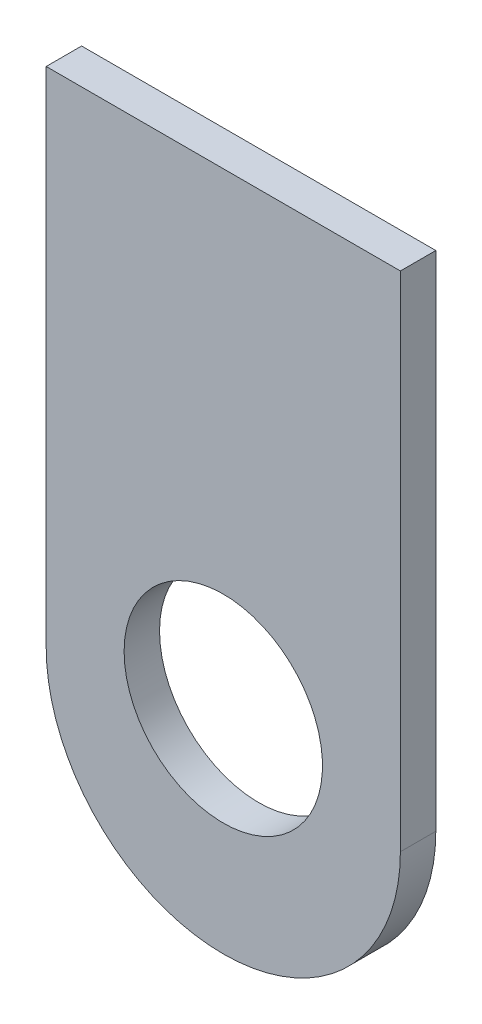
ISO-10303-21;
HEADER;
FILE_DESCRIPTION(('STEP AP214'),'2;1');
FILE_NAME('part.step','',(''),(''),'','','');
FILE_SCHEMA(('AUTOMOTIVE_DESIGN { 1 0 10303 214 1 1 1 1 }'));
ENDSEC;
DATA;
#1=APPLICATION_CONTEXT('core data for automotive mechanical design processes');
#2=APPLICATION_PROTOCOL_DEFINITION('international standard','automotive_design',2000,#1);
#3=PRODUCT_CONTEXT('',#1,'mechanical');
#4=PRODUCT('Part','Part','',(#3));
#5=PRODUCT_RELATED_PRODUCT_CATEGORY('part','',(#4));
#6=PRODUCT_DEFINITION_FORMATION('','',#4);
#7=PRODUCT_DEFINITION_CONTEXT('part definition',#1,'design');
#8=PRODUCT_DEFINITION('design','',#6,#7);
#9=PRODUCT_DEFINITION_SHAPE('','',#8);
#10=(LENGTH_UNIT() NAMED_UNIT(*) SI_UNIT(.MILLI.,.METRE.));
#11=(NAMED_UNIT(*) PLANE_ANGLE_UNIT() SI_UNIT($,.RADIAN.));
#12=(NAMED_UNIT(*) SI_UNIT($,.STERADIAN.) SOLID_ANGLE_UNIT());
#13=UNCERTAINTY_MEASURE_WITH_UNIT(LENGTH_MEASURE(1.E-05),#10,'distance_accuracy_value','');
#14=(GEOMETRIC_REPRESENTATION_CONTEXT(3) GLOBAL_UNCERTAINTY_ASSIGNED_CONTEXT((#13)) GLOBAL_UNIT_ASSIGNED_CONTEXT((#10,
#11,#12)) REPRESENTATION_CONTEXT('',''));
#15=CARTESIAN_POINT('',(0.,0.,0.));
#16=DIRECTION('',(0.,0.,1.));
#17=DIRECTION('',(1.,0.,0.));
#18=AXIS2_PLACEMENT_3D('',#15,#16,#17);
#19=CARTESIAN_POINT('',(-1.25,500000.,-7.825));
#20=DIRECTION('',(0.,0.,-1.));
#21=DIRECTION('',(-1.,0.,0.));
#22=AXIS2_PLACEMENT_3D('',#19,#20,#21);
#23=PLANE('',#22);
#24=CARTESIAN_POINT('',(0.,-2.,-7.825));
#25=DIRECTION('',(0.,0.,-1.));
#26=DIRECTION('',(-1.,0.,0.));
#27=AXIS2_PLACEMENT_3D('',#24,#25,#26);
#28=CIRCLE('',#27,0.7);
#29=CARTESIAN_POINT('',(-0.7,-2.,-7.825));
#30=VERTEX_POINT('',#29);
#31=EDGE_CURVE('E86',#30,#30,#28,.F.);
#32=ORIENTED_EDGE('',*,*,#31,.T.);
#33=EDGE_LOOP('',(#32));
#34=FACE_BOUND('',#33,.T.);
#35=DIRECTION('',(0.,1.,0.));
#36=VECTOR('',#35,1.);
#37=CARTESIAN_POINT('',(-1.25,500000.,-7.825));
#38=LINE('',#37,#36);
#39=CARTESIAN_POINT('',(-1.25,1.30000000008561,-7.825));
#40=VERTEX_POINT('',#39);
#41=CARTESIAN_POINT('',(-1.25,-2.25000000000182,-7.825));
#42=VERTEX_POINT('',#41);
#43=EDGE_CURVE('E59',#40,#42,#38,.F.);
#44=ORIENTED_EDGE('',*,*,#43,.F.);
#45=DIRECTION('',(1.,0.,0.));
#46=VECTOR('',#45,1.);
#47=CARTESIAN_POINT('',(-1.575,1.3,-7.825));
#48=LINE('',#47,#46);
#49=CARTESIAN_POINT('',(1.25,1.30000000004281,-7.825));
#50=VERTEX_POINT('',#49);
#51=EDGE_CURVE('E73',#50,#40,#48,.F.);
#52=ORIENTED_EDGE('',*,*,#51,.F.);
#53=DIRECTION('',(0.,1.,0.));
#54=VECTOR('',#53,1.);
#55=CARTESIAN_POINT('',(1.25,500000.,-7.825));
#56=LINE('',#55,#54);
#57=CARTESIAN_POINT('',(1.25,-2.25000000000182,-7.825));
#58=VERTEX_POINT('',#57);
#59=EDGE_CURVE('E60',#58,#50,#56,.T.);
#60=ORIENTED_EDGE('',*,*,#59,.F.);
#61=CARTESIAN_POINT('',(0.,-2.25,-7.825));
#62=DIRECTION('',(0.,0.,-1.));
#63=DIRECTION('',(-1.,0.,0.));
#64=AXIS2_PLACEMENT_3D('',#61,#62,#63);
#65=CIRCLE('',#64,1.25);
#66=EDGE_CURVE('E20',#42,#58,#65,.F.);
#67=ORIENTED_EDGE('',*,*,#66,.F.);
#68=EDGE_LOOP('',(#44,#52,#60,#67));
#69=FACE_BOUND('',#68,.T.);
#70=ADVANCED_FACE('F17',(#34,#69),#23,.T.);
#71=CARTESIAN_POINT('',(0.,-2.25,-9.804898987322));
#72=DIRECTION('',(0.,0.,-1.));
#73=DIRECTION('',(-1.,0.,0.));
#74=AXIS2_PLACEMENT_3D('',#71,#72,#73);
#75=CYLINDRICAL_SURFACE('',#74,1.25);
#76=CARTESIAN_POINT('',(0.,-2.25,-7.575));
#77=DIRECTION('',(0.,0.,-1.));
#78=DIRECTION('',(-1.,0.,0.));
#79=AXIS2_PLACEMENT_3D('',#76,#77,#78);
#80=CIRCLE('',#79,1.25);
#81=CARTESIAN_POINT('',(-1.25,-2.25000000000182,-7.575));
#82=VERTEX_POINT('',#81);
#83=CARTESIAN_POINT('',(1.25,-2.25000000000182,-7.575));
#84=VERTEX_POINT('',#83);
#85=EDGE_CURVE('E68',#82,#84,#80,.F.);
#86=ORIENTED_EDGE('',*,*,#85,.F.);
#87=DIRECTION('',(0.,0.,1.));
#88=VECTOR('',#87,1.);
#89=CARTESIAN_POINT('',(-1.25,-2.25000000000364,-7.575));
#90=LINE('',#89,#88);
#91=EDGE_CURVE('E65',#42,#82,#90,.T.);
#92=ORIENTED_EDGE('',*,*,#91,.F.);
#93=ORIENTED_EDGE('',*,*,#66,.T.);
#94=DIRECTION('',(0.,0.,-1.));
#95=VECTOR('',#94,1.);
#96=CARTESIAN_POINT('',(1.25,-2.25000000000364,-7.575));
#97=LINE('',#96,#95);
#98=EDGE_CURVE('E63',#84,#58,#97,.T.);
#99=ORIENTED_EDGE('',*,*,#98,.F.);
#100=EDGE_LOOP('',(#86,#92,#93,#99));
#101=FACE_BOUND('',#100,.T.);
#102=ADVANCED_FACE('F66',(#101),#75,.T.);
#103=CARTESIAN_POINT('',(1.25,500000.,-7.575));
#104=DIRECTION('',(1.,0.,0.));
#105=DIRECTION('',(0.,0.,-1.));
#106=AXIS2_PLACEMENT_3D('',#103,#104,#105);
#107=PLANE('',#106);
#108=DIRECTION('',(0.,0.,1.));
#109=VECTOR('',#108,1.);
#110=CARTESIAN_POINT('',(1.25,1.3,-7.3));
#111=LINE('',#110,#109);
#112=CARTESIAN_POINT('',(1.25,1.30000000008561,-7.575));
#113=VERTEX_POINT('',#112);
#114=EDGE_CURVE('E75',#113,#50,#111,.F.);
#115=ORIENTED_EDGE('',*,*,#114,.F.);
#116=DIRECTION('',(0.,1.,0.));
#117=VECTOR('',#116,1.);
#118=CARTESIAN_POINT('',(1.25,500000.,-7.575));
#119=LINE('',#118,#117);
#120=EDGE_CURVE('E85',#84,#113,#119,.T.);
#121=ORIENTED_EDGE('',*,*,#120,.F.);
#122=ORIENTED_EDGE('',*,*,#98,.T.);
#123=ORIENTED_EDGE('',*,*,#59,.T.);
#124=EDGE_LOOP('',(#115,#121,#122,#123));
#125=FACE_BOUND('',#124,.T.);
#126=ADVANCED_FACE('F106',(#125),#107,.T.);
#127=CARTESIAN_POINT('',(-1.575,1.3,-7.3));
#128=DIRECTION('',(0.,1.,0.));
#129=DIRECTION('',(0.,0.,1.));
#130=AXIS2_PLACEMENT_3D('',#127,#128,#129);
#131=PLANE('',#130);
#132=DIRECTION('',(0.,0.,1.));
#133=VECTOR('',#132,1.);
#134=CARTESIAN_POINT('',(-1.25,1.30000000012842,-7.575));
#135=LINE('',#134,#133);
#136=CARTESIAN_POINT('',(-1.25,1.30000000012842,-7.575));
#137=VERTEX_POINT('',#136);
#138=EDGE_CURVE('E35',#137,#40,#135,.F.);
#139=ORIENTED_EDGE('',*,*,#138,.F.);
#140=DIRECTION('',(1.,0.,0.));
#141=VECTOR('',#140,1.);
#142=CARTESIAN_POINT('',(-1.25,1.30000000012842,-7.575));
#143=LINE('',#142,#141);
#144=EDGE_CURVE('E95',#113,#137,#143,.F.);
#145=ORIENTED_EDGE('',*,*,#144,.F.);
#146=ORIENTED_EDGE('',*,*,#114,.T.);
#147=ORIENTED_EDGE('',*,*,#51,.T.);
#148=EDGE_LOOP('',(#139,#145,#146,#147));
#149=FACE_BOUND('',#148,.T.);
#150=ADVANCED_FACE('F115',(#149),#131,.T.);
#151=CARTESIAN_POINT('',(-1.25,500000.,-7.575));
#152=DIRECTION('',(-1.,0.,0.));
#153=DIRECTION('',(0.,0.,1.));
#154=AXIS2_PLACEMENT_3D('',#151,#152,#153);
#155=PLANE('',#154);
#156=DIRECTION('',(0.,1.,0.));
#157=VECTOR('',#156,1.);
#158=CARTESIAN_POINT('',(-1.25,500000.,-7.575));
#159=LINE('',#158,#157);
#160=EDGE_CURVE('E26',#137,#82,#159,.F.);
#161=ORIENTED_EDGE('',*,*,#160,.F.);
#162=ORIENTED_EDGE('',*,*,#138,.T.);
#163=ORIENTED_EDGE('',*,*,#43,.T.);
#164=ORIENTED_EDGE('',*,*,#91,.T.);
#165=EDGE_LOOP('',(#161,#162,#163,#164));
#166=FACE_BOUND('',#165,.T.);
#167=ADVANCED_FACE('F72',(#166),#155,.T.);
#168=CARTESIAN_POINT('',(0.,-2.,-9.804898987322));
#169=DIRECTION('',(0.,0.,-1.));
#170=DIRECTION('',(-1.,0.,0.));
#171=AXIS2_PLACEMENT_3D('',#168,#169,#170);
#172=CYLINDRICAL_SURFACE('',#171,0.7);
#173=CARTESIAN_POINT('',(0.,-2.,-7.575));
#174=DIRECTION('',(0.,0.,-1.));
#175=DIRECTION('',(-1.,0.,0.));
#176=AXIS2_PLACEMENT_3D('',#173,#174,#175);
#177=CIRCLE('',#176,0.7);
#178=CARTESIAN_POINT('',(-0.7,-2.,-7.575));
#179=VERTEX_POINT('',#178);
#180=EDGE_CURVE('E11',#179,#179,#177,.T.);
#181=ORIENTED_EDGE('',*,*,#180,.F.);
#182=EDGE_LOOP('',(#181));
#183=FACE_BOUND('',#182,.T.);
#184=ORIENTED_EDGE('',*,*,#31,.F.);
#185=EDGE_LOOP('',(#184));
#186=FACE_BOUND('',#185,.T.);
#187=ADVANCED_FACE('F123',(#183,#186),#172,.F.);
#188=CARTESIAN_POINT('',(-1.25,500000.,-7.575));
#189=DIRECTION('',(0.,0.,1.));
#190=DIRECTION('',(1.,0.,0.));
#191=AXIS2_PLACEMENT_3D('',#188,#189,#190);
#192=PLANE('',#191);
#193=ORIENTED_EDGE('',*,*,#180,.T.);
#194=EDGE_LOOP('',(#193));
#195=FACE_BOUND('',#194,.T.);
#196=ORIENTED_EDGE('',*,*,#144,.T.);
#197=ORIENTED_EDGE('',*,*,#160,.T.);
#198=ORIENTED_EDGE('',*,*,#85,.T.);
#199=ORIENTED_EDGE('',*,*,#120,.T.);
#200=EDGE_LOOP('',(#196,#197,#198,#199));
#201=FACE_BOUND('',#200,.T.);
#202=ADVANCED_FACE('F110',(#195,#201),#192,.T.);
#203=CLOSED_SHELL('',(#70,#102,#126,#150,#167,#187,#202));
#204=MANIFOLD_SOLID_BREP('B1',#203);
#205=ADVANCED_BREP_SHAPE_REPRESENTATION('',(#18,#204),#14);
#206=SHAPE_DEFINITION_REPRESENTATION(#9,#205);
ENDSEC;
END-ISO-10303-21;
